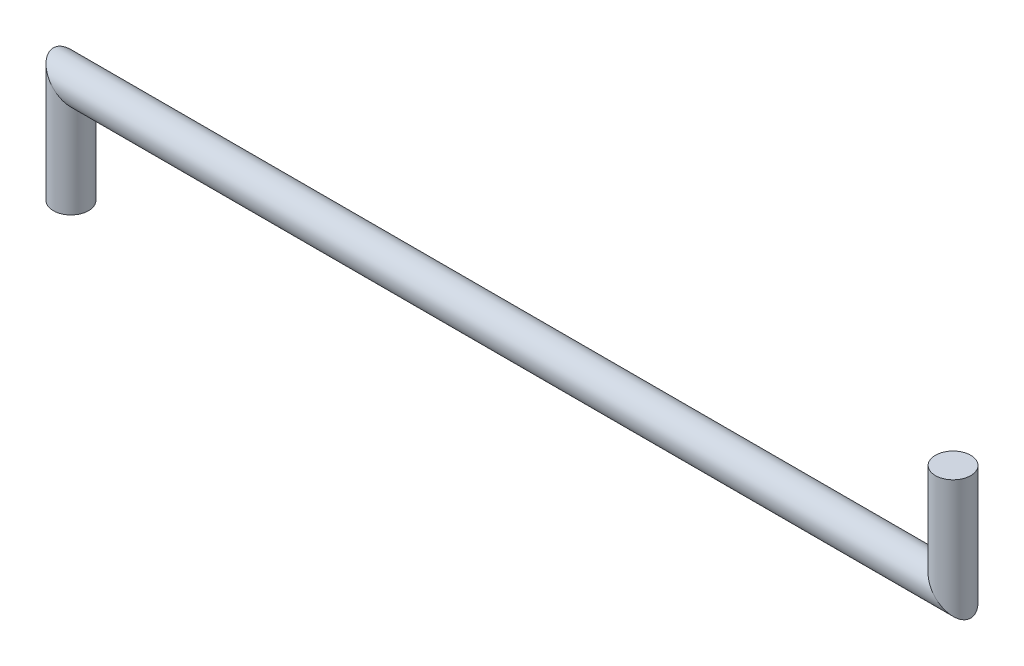
ISO-10303-21;
HEADER;
FILE_DESCRIPTION(('STEP AP214'),'2;1');
FILE_NAME('part.step','',(''),(''),'','','');
FILE_SCHEMA(('AUTOMOTIVE_DESIGN { 1 0 10303 214 1 1 1 1 }'));
ENDSEC;
DATA;
#1=APPLICATION_CONTEXT('core data for automotive mechanical design processes');
#2=APPLICATION_PROTOCOL_DEFINITION('international standard','automotive_design',2000,#1);
#3=PRODUCT_CONTEXT('',#1,'mechanical');
#4=PRODUCT('Part','Part','',(#3));
#5=PRODUCT_RELATED_PRODUCT_CATEGORY('part','',(#4));
#6=PRODUCT_DEFINITION_FORMATION('','',#4);
#7=PRODUCT_DEFINITION_CONTEXT('part definition',#1,'design');
#8=PRODUCT_DEFINITION('design','',#6,#7);
#9=PRODUCT_DEFINITION_SHAPE('','',#8);
#10=(LENGTH_UNIT() NAMED_UNIT(*) SI_UNIT(.MILLI.,.METRE.));
#11=(NAMED_UNIT(*) PLANE_ANGLE_UNIT() SI_UNIT($,.RADIAN.));
#12=(NAMED_UNIT(*) SI_UNIT($,.STERADIAN.) SOLID_ANGLE_UNIT());
#13=UNCERTAINTY_MEASURE_WITH_UNIT(LENGTH_MEASURE(1.E-05),#10,'distance_accuracy_value','');
#14=(GEOMETRIC_REPRESENTATION_CONTEXT(3) GLOBAL_UNCERTAINTY_ASSIGNED_CONTEXT((#13)) GLOBAL_UNIT_ASSIGNED_CONTEXT((#10,
#11,#12)) REPRESENTATION_CONTEXT('',''));
#15=CARTESIAN_POINT('',(0.,0.,0.));
#16=DIRECTION('',(0.,0.,1.));
#17=DIRECTION('',(1.,0.,0.));
#18=AXIS2_PLACEMENT_3D('',#15,#16,#17);
#19=CARTESIAN_POINT('',(-37.0817848266067,7.90140845070422,0.));
#20=DIRECTION('',(0.,1.,0.));
#21=DIRECTION('',(0.,0.,1.));
#22=AXIS2_PLACEMENT_3D('',#19,#20,#21);
#23=PLANE('',#22);
#24=CARTESIAN_POINT('',(-37.0817848266067,7.90140845070422,0.));
#25=DIRECTION('',(0.,1.,0.));
#26=DIRECTION('',(0.,0.,1.));
#27=AXIS2_PLACEMENT_3D('',#24,#25,#26);
#28=CIRCLE('',#27,0.499999999999999);
#29=CARTESIAN_POINT('',(-37.0817848266067,7.90140845070422,0.499999999999999));
#30=VERTEX_POINT('',#29);
#31=EDGE_CURVE('E36',#30,#30,#28,.T.);
#32=ORIENTED_EDGE('',*,*,#31,.T.);
#33=EDGE_LOOP('',(#32));
#34=FACE_BOUND('',#33,.T.);
#35=ADVANCED_FACE('F33',(#34),#23,.T.);
#36=CARTESIAN_POINT('',(-62.0817848266067,1.90140845070422,0.));
#37=DIRECTION('',(0.,1.,0.));
#38=DIRECTION('',(0.,0.,1.));
#39=AXIS2_PLACEMENT_3D('',#36,#37,#38);
#40=PLANE('',#39);
#41=CARTESIAN_POINT('',(-62.0817848266067,1.90140845070422,0.));
#42=DIRECTION('',(0.,1.,0.));
#43=DIRECTION('',(0.,0.,1.));
#44=AXIS2_PLACEMENT_3D('',#41,#42,#43);
#45=CIRCLE('',#44,0.499999999999999);
#46=CARTESIAN_POINT('',(-62.0817848266067,1.90140845070422,0.499999999999999));
#47=VERTEX_POINT('',#46);
#48=EDGE_CURVE('E41',#47,#47,#45,.T.);
#49=ORIENTED_EDGE('',*,*,#48,.F.);
#50=EDGE_LOOP('',(#49));
#51=FACE_BOUND('',#50,.T.);
#52=ADVANCED_FACE('F73',(#51),#40,.F.);
#53=CARTESIAN_POINT('',(-37.0817848266067,3.70140845070422,0.));
#54=DIRECTION('',(0.,1.,0.));
#55=DIRECTION('',(0.,0.,1.));
#56=AXIS2_PLACEMENT_3D('',#53,#54,#55);
#57=CYLINDRICAL_SURFACE('',#56,0.499999999999999);
#58=CARTESIAN_POINT('',(-37.0817848266067,4.90140845070422,0.));
#59=DIRECTION('',(0.707106781186548,0.707106781186548,0.));
#60=DIRECTION('',(0.707106781186548,-0.707106781186548,0.));
#61=AXIS2_PLACEMENT_3D('',#58,#59,#60);
#62=ELLIPSE('',#61,0.707106781186546,0.499999999999999);
#63=CARTESIAN_POINT('',(-36.5817848266067,4.40140845070422,0.));
#64=VERTEX_POINT('',#63);
#65=EDGE_CURVE('E51',#64,#64,#62,.F.);
#66=ORIENTED_EDGE('',*,*,#65,.F.);
#67=EDGE_LOOP('',(#66));
#68=FACE_BOUND('',#67,.T.);
#69=ORIENTED_EDGE('',*,*,#31,.F.);
#70=EDGE_LOOP('',(#69));
#71=FACE_BOUND('',#70,.T.);
#72=ADVANCED_FACE('F68',(#68,#71),#57,.T.);
#73=CARTESIAN_POINT('',(-63.2817848266067,4.90140845070422,0.));
#74=DIRECTION('',(1.,0.,0.));
#75=DIRECTION('',(0.,0.,-1.));
#76=AXIS2_PLACEMENT_3D('',#73,#74,#75);
#77=CYLINDRICAL_SURFACE('',#76,0.499999999999999);
#78=CARTESIAN_POINT('',(-62.0817848266067,4.90140845070422,0.));
#79=DIRECTION('',(0.707106781186548,0.707106781186548,0.));
#80=DIRECTION('',(-0.707106781186548,0.707106781186548,0.));
#81=AXIS2_PLACEMENT_3D('',#78,#79,#80);
#82=ELLIPSE('',#81,0.707106781186546,0.499999999999999);
#83=CARTESIAN_POINT('',(-62.5817848266067,5.40140845070422,0.));
#84=VERTEX_POINT('',#83);
#85=EDGE_CURVE('E11',#84,#84,#82,.F.);
#86=ORIENTED_EDGE('',*,*,#85,.F.);
#87=EDGE_LOOP('',(#86));
#88=FACE_BOUND('',#87,.T.);
#89=ORIENTED_EDGE('',*,*,#65,.T.);
#90=EDGE_LOOP('',(#89));
#91=FACE_BOUND('',#90,.T.);
#92=ADVANCED_FACE('F58',(#88,#91),#77,.T.);
#93=CARTESIAN_POINT('',(-62.0817848266067,1.90140845070422,0.));
#94=DIRECTION('',(0.,1.,0.));
#95=DIRECTION('',(0.,0.,1.));
#96=AXIS2_PLACEMENT_3D('',#93,#94,#95);
#97=CYLINDRICAL_SURFACE('',#96,0.499999999999999);
#98=ORIENTED_EDGE('',*,*,#48,.T.);
#99=EDGE_LOOP('',(#98));
#100=FACE_BOUND('',#99,.T.);
#101=ORIENTED_EDGE('',*,*,#85,.T.);
#102=EDGE_LOOP('',(#101));
#103=FACE_BOUND('',#102,.T.);
#104=ADVANCED_FACE('F61',(#100,#103),#97,.T.);
#105=CLOSED_SHELL('',(#35,#52,#72,#92,#104));
#106=MANIFOLD_SOLID_BREP('B2',#105);
#107=ADVANCED_BREP_SHAPE_REPRESENTATION('',(#18,#106),#14);
#108=SHAPE_DEFINITION_REPRESENTATION(#9,#107);
ENDSEC;
END-ISO-10303-21;
